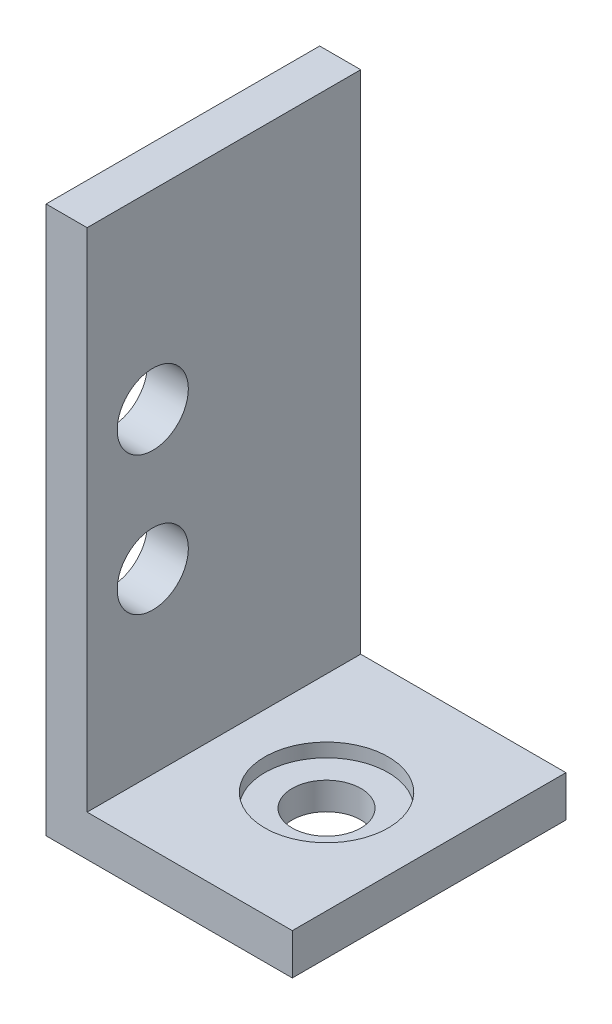
ISO-10303-21;
HEADER;
FILE_DESCRIPTION(('STEP AP214'),'2;1');
FILE_NAME('part.step','',(''),(''),'','','');
FILE_SCHEMA(('AUTOMOTIVE_DESIGN { 1 0 10303 214 1 1 1 1 }'));
ENDSEC;
DATA;
#1=APPLICATION_CONTEXT('core data for automotive mechanical design processes');
#2=APPLICATION_PROTOCOL_DEFINITION('international standard','automotive_design',2000,#1);
#3=PRODUCT_CONTEXT('',#1,'mechanical');
#4=PRODUCT('Part','Part','',(#3));
#5=PRODUCT_RELATED_PRODUCT_CATEGORY('part','',(#4));
#6=PRODUCT_DEFINITION_FORMATION('','',#4);
#7=PRODUCT_DEFINITION_CONTEXT('part definition',#1,'design');
#8=PRODUCT_DEFINITION('design','',#6,#7);
#9=PRODUCT_DEFINITION_SHAPE('','',#8);
#10=(LENGTH_UNIT() NAMED_UNIT(*) SI_UNIT(.MILLI.,.METRE.));
#11=(NAMED_UNIT(*) PLANE_ANGLE_UNIT() SI_UNIT($,.RADIAN.));
#12=(NAMED_UNIT(*) SI_UNIT($,.STERADIAN.) SOLID_ANGLE_UNIT());
#13=UNCERTAINTY_MEASURE_WITH_UNIT(LENGTH_MEASURE(1.E-05),#10,'distance_accuracy_value','');
#14=(GEOMETRIC_REPRESENTATION_CONTEXT(3) GLOBAL_UNCERTAINTY_ASSIGNED_CONTEXT((#13)) GLOBAL_UNIT_ASSIGNED_CONTEXT((#10,
#11,#12)) REPRESENTATION_CONTEXT('',''));
#15=CARTESIAN_POINT('',(0.,0.,0.));
#16=DIRECTION('',(0.,0.,1.));
#17=DIRECTION('',(1.,0.,0.));
#18=AXIS2_PLACEMENT_3D('',#15,#16,#17);
#19=CARTESIAN_POINT('',(30.6258807045637,3.,-9.11509707766213));
#20=DIRECTION('',(0.,0.,-1.));
#21=DIRECTION('',(-1.,0.,0.));
#22=AXIS2_PLACEMENT_3D('',#19,#20,#21);
#23=PLANE('',#22);
#24=DIRECTION('',(0.,1.,0.));
#25=VECTOR('',#24,1.);
#26=CARTESIAN_POINT('',(15.6258807045637,0.,-9.11509707766213));
#27=LINE('',#26,#25);
#28=CARTESIAN_POINT('',(15.6258807045637,3.,-9.11509707766213));
#29=VERTEX_POINT('',#28);
#30=CARTESIAN_POINT('',(15.6258807045636,40.,-9.11509707766213));
#31=VERTEX_POINT('',#30);
#32=EDGE_CURVE('E50',#29,#31,#27,.T.);
#33=ORIENTED_EDGE('',*,*,#32,.T.);
#34=DIRECTION('',(-1.,0.,0.));
#35=VECTOR('',#34,1.);
#36=CARTESIAN_POINT('',(15.6258807045636,40.,-9.11509707766213));
#37=LINE('',#36,#35);
#38=CARTESIAN_POINT('',(12.6258807045636,40.,-9.11509707766213));
#39=VERTEX_POINT('',#38);
#40=EDGE_CURVE('E127',#31,#39,#37,.T.);
#41=ORIENTED_EDGE('',*,*,#40,.T.);
#42=DIRECTION('',(0.,1.,0.));
#43=VECTOR('',#42,1.);
#44=CARTESIAN_POINT('',(12.6258807045636,0.,-9.11509707766213));
#45=LINE('',#44,#43);
#46=CARTESIAN_POINT('',(12.6258807045636,0.,-9.11509707766213));
#47=VERTEX_POINT('',#46);
#48=EDGE_CURVE('E96',#47,#39,#45,.T.);
#49=ORIENTED_EDGE('',*,*,#48,.F.);
#50=DIRECTION('',(1.,0.,0.));
#51=VECTOR('',#50,1.);
#52=CARTESIAN_POINT('',(30.6258807045637,0.,-9.11509707766213));
#53=LINE('',#52,#51);
#54=CARTESIAN_POINT('',(30.6258807045637,0.,-9.11509707766213));
#55=VERTEX_POINT('',#54);
#56=EDGE_CURVE('E93',#47,#55,#53,.T.);
#57=ORIENTED_EDGE('',*,*,#56,.T.);
#58=DIRECTION('',(0.,-1.,0.));
#59=VECTOR('',#58,1.);
#60=CARTESIAN_POINT('',(30.6258807045637,3.,-9.11509707766213));
#61=LINE('',#60,#59);
#62=CARTESIAN_POINT('',(30.6258807045637,3.,-9.11509707766213));
#63=VERTEX_POINT('',#62);
#64=EDGE_CURVE('E11',#63,#55,#61,.T.);
#65=ORIENTED_EDGE('',*,*,#64,.F.);
#66=DIRECTION('',(1.,0.,0.));
#67=VECTOR('',#66,1.);
#68=CARTESIAN_POINT('',(30.6258807045637,3.,-9.11509707766213));
#69=LINE('',#68,#67);
#70=EDGE_CURVE('E85',#29,#63,#69,.T.);
#71=ORIENTED_EDGE('',*,*,#70,.F.);
#72=EDGE_LOOP('',(#33,#41,#49,#57,#65,#71));
#73=FACE_BOUND('',#72,.T.);
#74=ADVANCED_FACE('F33',(#73),#23,.F.);
#75=CARTESIAN_POINT('',(15.6258807045636,3.,-29.1150970776621));
#76=DIRECTION('',(0.,0.,1.));
#77=DIRECTION('',(1.,0.,0.));
#78=AXIS2_PLACEMENT_3D('',#75,#76,#77);
#79=PLANE('',#78);
#80=DIRECTION('',(0.,1.,0.));
#81=VECTOR('',#80,1.);
#82=CARTESIAN_POINT('',(12.6258807045636,0.,-29.1150970776621));
#83=LINE('',#82,#81);
#84=CARTESIAN_POINT('',(12.6258807045636,0.,-29.1150970776621));
#85=VERTEX_POINT('',#84);
#86=CARTESIAN_POINT('',(12.6258807045636,40.,-29.1150970776622));
#87=VERTEX_POINT('',#86);
#88=EDGE_CURVE('E118',#85,#87,#83,.T.);
#89=ORIENTED_EDGE('',*,*,#88,.T.);
#90=DIRECTION('',(-1.,0.,0.));
#91=VECTOR('',#90,1.);
#92=CARTESIAN_POINT('',(15.6258807045636,40.,-29.1150970776622));
#93=LINE('',#92,#91);
#94=CARTESIAN_POINT('',(15.6258807045636,40.,-29.1150970776622));
#95=VERTEX_POINT('',#94);
#96=EDGE_CURVE('E126',#95,#87,#93,.T.);
#97=ORIENTED_EDGE('',*,*,#96,.F.);
#98=DIRECTION('',(0.,1.,0.));
#99=VECTOR('',#98,1.);
#100=CARTESIAN_POINT('',(15.6258807045636,0.,-29.1150970776621));
#101=LINE('',#100,#99);
#102=CARTESIAN_POINT('',(15.6258807045636,3.,-29.1150970776621));
#103=VERTEX_POINT('',#102);
#104=EDGE_CURVE('E115',#103,#95,#101,.T.);
#105=ORIENTED_EDGE('',*,*,#104,.F.);
#106=DIRECTION('',(-1.,0.,0.));
#107=VECTOR('',#106,1.);
#108=CARTESIAN_POINT('',(15.6258807045636,3.,-29.1150970776621));
#109=LINE('',#108,#107);
#110=CARTESIAN_POINT('',(30.6258807045637,3.,-29.1150970776621));
#111=VERTEX_POINT('',#110);
#112=EDGE_CURVE('E84',#111,#103,#109,.T.);
#113=ORIENTED_EDGE('',*,*,#112,.F.);
#114=DIRECTION('',(0.,-1.,0.));
#115=VECTOR('',#114,1.);
#116=CARTESIAN_POINT('',(30.6258807045637,3.,-29.1150970776621));
#117=LINE('',#116,#115);
#118=CARTESIAN_POINT('',(30.6258807045637,0.,-29.1150970776621));
#119=VERTEX_POINT('',#118);
#120=EDGE_CURVE('E42',#111,#119,#117,.T.);
#121=ORIENTED_EDGE('',*,*,#120,.T.);
#122=DIRECTION('',(-1.,0.,0.));
#123=VECTOR('',#122,1.);
#124=CARTESIAN_POINT('',(15.6258807045636,0.,-29.1150970776621));
#125=LINE('',#124,#123);
#126=EDGE_CURVE('E90',#119,#85,#125,.T.);
#127=ORIENTED_EDGE('',*,*,#126,.T.);
#128=EDGE_LOOP('',(#89,#97,#105,#113,#121,#127));
#129=FACE_BOUND('',#128,.T.);
#130=ADVANCED_FACE('F163',(#129),#79,.F.);
#131=CARTESIAN_POINT('',(15.6258807045636,0.,-29.1150970776621));
#132=DIRECTION('',(1.,0.,0.));
#133=DIRECTION('',(0.,0.,-1.));
#134=AXIS2_PLACEMENT_3D('',#131,#132,#133);
#135=PLANE('',#134);
#136=CARTESIAN_POINT('',(15.6258807045636,16.,-13.9150970776621));
#137=DIRECTION('',(1.,0.,0.));
#138=DIRECTION('',(0.,0.,-1.));
#139=AXIS2_PLACEMENT_3D('',#136,#137,#138);
#140=CIRCLE('',#139,2.6);
#141=CARTESIAN_POINT('',(15.6258807045636,16.,-16.5150970776621));
#142=VERTEX_POINT('',#141);
#143=EDGE_CURVE('E144',#142,#142,#140,.T.);
#144=ORIENTED_EDGE('',*,*,#143,.F.);
#145=EDGE_LOOP('',(#144));
#146=FACE_BOUND('',#145,.T.);
#147=CARTESIAN_POINT('',(15.6258807045636,26.1,-13.9150970776621));
#148=DIRECTION('',(1.,0.,0.));
#149=DIRECTION('',(0.,0.,-1.));
#150=AXIS2_PLACEMENT_3D('',#147,#148,#149);
#151=CIRCLE('',#150,2.6);
#152=CARTESIAN_POINT('',(15.6258807045636,26.1,-16.5150970776621));
#153=VERTEX_POINT('',#152);
#154=EDGE_CURVE('E138',#153,#153,#151,.T.);
#155=ORIENTED_EDGE('',*,*,#154,.F.);
#156=EDGE_LOOP('',(#155));
#157=FACE_BOUND('',#156,.T.);
#158=ORIENTED_EDGE('',*,*,#104,.T.);
#159=DIRECTION('',(0.,0.,-1.));
#160=VECTOR('',#159,1.);
#161=CARTESIAN_POINT('',(15.6258807045636,40.,-29.1150970776622));
#162=LINE('',#161,#160);
#163=EDGE_CURVE('E129',#31,#95,#162,.T.);
#164=ORIENTED_EDGE('',*,*,#163,.F.);
#165=ORIENTED_EDGE('',*,*,#32,.F.);
#166=DIRECTION('',(0.,0.,1.));
#167=VECTOR('',#166,1.);
#168=CARTESIAN_POINT('',(15.6258807045637,3.,-9.11509707766213));
#169=LINE('',#168,#167);
#170=EDGE_CURVE('E67',#103,#29,#169,.T.);
#171=ORIENTED_EDGE('',*,*,#170,.F.);
#172=EDGE_LOOP('',(#158,#164,#165,#171));
#173=FACE_BOUND('',#172,.T.);
#174=ADVANCED_FACE('F160',(#146,#157,#173),#135,.T.);
#175=CARTESIAN_POINT('',(12.6258807045636,0.,-29.1150970776621));
#176=DIRECTION('',(-1.,0.,0.));
#177=DIRECTION('',(0.,0.,1.));
#178=AXIS2_PLACEMENT_3D('',#175,#176,#177);
#179=PLANE('',#178);
#180=CARTESIAN_POINT('',(12.6258807045636,16.,-13.9150970776621));
#181=DIRECTION('',(1.,0.,0.));
#182=DIRECTION('',(0.,0.,-1.));
#183=AXIS2_PLACEMENT_3D('',#180,#181,#182);
#184=CIRCLE('',#183,2.6);
#185=CARTESIAN_POINT('',(12.6258807045636,16.,-16.5150970776621));
#186=VERTEX_POINT('',#185);
#187=EDGE_CURVE('E135',#186,#186,#184,.T.);
#188=ORIENTED_EDGE('',*,*,#187,.T.);
#189=EDGE_LOOP('',(#188));
#190=FACE_BOUND('',#189,.T.);
#191=CARTESIAN_POINT('',(12.6258807045636,26.1,-13.9150970776621));
#192=DIRECTION('',(1.,0.,0.));
#193=DIRECTION('',(0.,0.,-1.));
#194=AXIS2_PLACEMENT_3D('',#191,#192,#193);
#195=CIRCLE('',#194,2.6);
#196=CARTESIAN_POINT('',(12.6258807045636,26.1,-16.5150970776621));
#197=VERTEX_POINT('',#196);
#198=EDGE_CURVE('E141',#197,#197,#195,.T.);
#199=ORIENTED_EDGE('',*,*,#198,.T.);
#200=EDGE_LOOP('',(#199));
#201=FACE_BOUND('',#200,.T.);
#202=ORIENTED_EDGE('',*,*,#48,.T.);
#203=DIRECTION('',(0.,0.,-1.));
#204=VECTOR('',#203,1.);
#205=CARTESIAN_POINT('',(12.6258807045636,40.,-29.1150970776622));
#206=LINE('',#205,#204);
#207=EDGE_CURVE('E132',#39,#87,#206,.T.);
#208=ORIENTED_EDGE('',*,*,#207,.T.);
#209=ORIENTED_EDGE('',*,*,#88,.F.);
#210=DIRECTION('',(0.,0.,1.));
#211=VECTOR('',#210,1.);
#212=CARTESIAN_POINT('',(12.6258807045636,0.,-29.1150970776621));
#213=LINE('',#212,#211);
#214=EDGE_CURVE('E121',#85,#47,#213,.T.);
#215=ORIENTED_EDGE('',*,*,#214,.T.);
#216=EDGE_LOOP('',(#202,#208,#209,#215));
#217=FACE_BOUND('',#216,.T.);
#218=ADVANCED_FACE('F150',(#190,#201,#217),#179,.T.);
#219=CARTESIAN_POINT('',(23.1258807045636,3.,-19.1150970776621));
#220=DIRECTION('',(0.,-1.,0.));
#221=DIRECTION('',(0.,0.,-1.));
#222=AXIS2_PLACEMENT_3D('',#219,#220,#221);
#223=CYLINDRICAL_SURFACE('',#222,2.51);
#224=CARTESIAN_POINT('',(23.1258807045636,0.,-19.1150970776621));
#225=DIRECTION('',(0.,1.,0.));
#226=DIRECTION('',(0.,0.,1.));
#227=AXIS2_PLACEMENT_3D('',#224,#225,#226);
#228=CIRCLE('',#227,2.51);
#229=CARTESIAN_POINT('',(23.1258807045636,0.,-16.6050970776621));
#230=VERTEX_POINT('',#229);
#231=EDGE_CURVE('E99',#230,#230,#228,.T.);
#232=ORIENTED_EDGE('',*,*,#231,.F.);
#233=EDGE_LOOP('',(#232));
#234=FACE_BOUND('',#233,.T.);
#235=CARTESIAN_POINT('',(23.1258807045636,2.,-19.1150970776621));
#236=DIRECTION('',(0.,1.,0.));
#237=DIRECTION('',(0.,0.,1.));
#238=AXIS2_PLACEMENT_3D('',#235,#236,#237);
#239=CIRCLE('',#238,2.51);
#240=CARTESIAN_POINT('',(23.1258807045636,2.,-16.6050970776621));
#241=VERTEX_POINT('',#240);
#242=EDGE_CURVE('E36',#241,#241,#239,.T.);
#243=ORIENTED_EDGE('',*,*,#242,.T.);
#244=EDGE_LOOP('',(#243));
#245=FACE_BOUND('',#244,.T.);
#246=ADVANCED_FACE('F187',(#234,#245),#223,.F.);
#247=CARTESIAN_POINT('',(0.,3.,0.));
#248=DIRECTION('',(0.,-1.,0.));
#249=DIRECTION('',(0.,0.,-1.));
#250=AXIS2_PLACEMENT_3D('',#247,#248,#249);
#251=PLANE('',#250);
#252=CARTESIAN_POINT('',(23.1258807045636,3.,-19.1150970776621));
#253=DIRECTION('',(0.,1.,0.));
#254=DIRECTION('',(0.,0.,1.));
#255=AXIS2_PLACEMENT_3D('',#252,#253,#254);
#256=CIRCLE('',#255,4.51);
#257=CARTESIAN_POINT('',(23.1258807045636,3.,-14.6050970776621));
#258=VERTEX_POINT('',#257);
#259=EDGE_CURVE('E111',#258,#258,#256,.T.);
#260=ORIENTED_EDGE('',*,*,#259,.F.);
#261=EDGE_LOOP('',(#260));
#262=FACE_BOUND('',#261,.T.);
#263=ORIENTED_EDGE('',*,*,#70,.T.);
#264=DIRECTION('',(0.,0.,-1.));
#265=VECTOR('',#264,1.);
#266=CARTESIAN_POINT('',(30.6258807045637,3.,-9.11509707766213));
#267=LINE('',#266,#265);
#268=EDGE_CURVE('E75',#63,#111,#267,.T.);
#269=ORIENTED_EDGE('',*,*,#268,.T.);
#270=ORIENTED_EDGE('',*,*,#112,.T.);
#271=ORIENTED_EDGE('',*,*,#170,.T.);
#272=EDGE_LOOP('',(#263,#269,#270,#271));
#273=FACE_BOUND('',#272,.T.);
#274=ADVANCED_FACE('F88',(#262,#273),#251,.F.);
#275=CARTESIAN_POINT('',(0.,0.,0.));
#276=DIRECTION('',(0.,-1.,0.));
#277=DIRECTION('',(0.,0.,-1.));
#278=AXIS2_PLACEMENT_3D('',#275,#276,#277);
#279=PLANE('',#278);
#280=ORIENTED_EDGE('',*,*,#56,.F.);
#281=ORIENTED_EDGE('',*,*,#214,.F.);
#282=ORIENTED_EDGE('',*,*,#126,.F.);
#283=DIRECTION('',(0.,0.,-1.));
#284=VECTOR('',#283,1.);
#285=CARTESIAN_POINT('',(30.6258807045637,0.,-9.11509707766213));
#286=LINE('',#285,#284);
#287=EDGE_CURVE('E63',#55,#119,#286,.T.);
#288=ORIENTED_EDGE('',*,*,#287,.F.);
#289=EDGE_LOOP('',(#280,#281,#282,#288));
#290=FACE_BOUND('',#289,.T.);
#291=ORIENTED_EDGE('',*,*,#231,.T.);
#292=EDGE_LOOP('',(#291));
#293=FACE_BOUND('',#292,.T.);
#294=ADVANCED_FACE('F181',(#290,#293),#279,.T.);
#295=CARTESIAN_POINT('',(30.6258807045637,3.,-9.11509707766213));
#296=DIRECTION('',(-1.,0.,0.));
#297=DIRECTION('',(0.,0.,1.));
#298=AXIS2_PLACEMENT_3D('',#295,#296,#297);
#299=PLANE('',#298);
#300=ORIENTED_EDGE('',*,*,#287,.T.);
#301=ORIENTED_EDGE('',*,*,#120,.F.);
#302=ORIENTED_EDGE('',*,*,#268,.F.);
#303=ORIENTED_EDGE('',*,*,#64,.T.);
#304=EDGE_LOOP('',(#300,#301,#302,#303));
#305=FACE_BOUND('',#304,.T.);
#306=ADVANCED_FACE('F77',(#305),#299,.F.);
#307=CARTESIAN_POINT('',(23.1258807045636,2.,-19.1150970776621));
#308=DIRECTION('',(0.,1.,0.));
#309=DIRECTION('',(0.,0.,1.));
#310=AXIS2_PLACEMENT_3D('',#307,#308,#309);
#311=CYLINDRICAL_SURFACE('',#310,4.51);
#312=CARTESIAN_POINT('',(23.1258807045636,2.,-19.1150970776621));
#313=DIRECTION('',(0.,1.,0.));
#314=DIRECTION('',(0.,0.,1.));
#315=AXIS2_PLACEMENT_3D('',#312,#313,#314);
#316=CIRCLE('',#315,4.51);
#317=CARTESIAN_POINT('',(23.1258807045636,2.,-14.6050970776621));
#318=VERTEX_POINT('',#317);
#319=EDGE_CURVE('E114',#318,#318,#316,.T.);
#320=ORIENTED_EDGE('',*,*,#319,.F.);
#321=EDGE_LOOP('',(#320));
#322=FACE_BOUND('',#321,.T.);
#323=ORIENTED_EDGE('',*,*,#259,.T.);
#324=EDGE_LOOP('',(#323));
#325=FACE_BOUND('',#324,.T.);
#326=ADVANCED_FACE('F197',(#322,#325),#311,.F.);
#327=CARTESIAN_POINT('',(23.1258807045636,2.,-19.1150970776621));
#328=DIRECTION('',(0.,1.,0.));
#329=DIRECTION('',(0.,0.,1.));
#330=AXIS2_PLACEMENT_3D('',#327,#328,#329);
#331=PLANE('',#330);
#332=ORIENTED_EDGE('',*,*,#242,.F.);
#333=EDGE_LOOP('',(#332));
#334=FACE_BOUND('',#333,.T.);
#335=ORIENTED_EDGE('',*,*,#319,.T.);
#336=EDGE_LOOP('',(#335));
#337=FACE_BOUND('',#336,.T.);
#338=ADVANCED_FACE('F194',(#334,#337),#331,.T.);
#339=CARTESIAN_POINT('',(15.6258807045636,40.,-29.1150970776622));
#340=DIRECTION('',(0.,1.,0.));
#341=DIRECTION('',(0.,0.,1.));
#342=AXIS2_PLACEMENT_3D('',#339,#340,#341);
#343=PLANE('',#342);
#344=ORIENTED_EDGE('',*,*,#207,.F.);
#345=ORIENTED_EDGE('',*,*,#40,.F.);
#346=ORIENTED_EDGE('',*,*,#163,.T.);
#347=ORIENTED_EDGE('',*,*,#96,.T.);
#348=EDGE_LOOP('',(#344,#345,#346,#347));
#349=FACE_BOUND('',#348,.T.);
#350=ADVANCED_FACE('F175',(#349),#343,.T.);
#351=CARTESIAN_POINT('',(12.6258807045636,26.1,-13.9150970776621));
#352=DIRECTION('',(1.,0.,0.));
#353=DIRECTION('',(0.,0.,-1.));
#354=AXIS2_PLACEMENT_3D('',#351,#352,#353);
#355=CYLINDRICAL_SURFACE('',#354,2.6);
#356=ORIENTED_EDGE('',*,*,#198,.F.);
#357=EDGE_LOOP('',(#356));
#358=FACE_BOUND('',#357,.T.);
#359=ORIENTED_EDGE('',*,*,#154,.T.);
#360=EDGE_LOOP('',(#359));
#361=FACE_BOUND('',#360,.T.);
#362=ADVANCED_FACE('F156',(#358,#361),#355,.F.);
#363=CARTESIAN_POINT('',(12.6258807045636,16.,-13.9150970776621));
#364=DIRECTION('',(1.,0.,0.));
#365=DIRECTION('',(0.,0.,-1.));
#366=AXIS2_PLACEMENT_3D('',#363,#364,#365);
#367=CYLINDRICAL_SURFACE('',#366,2.6);
#368=ORIENTED_EDGE('',*,*,#187,.F.);
#369=EDGE_LOOP('',(#368));
#370=FACE_BOUND('',#369,.T.);
#371=ORIENTED_EDGE('',*,*,#143,.T.);
#372=EDGE_LOOP('',(#371));
#373=FACE_BOUND('',#372,.T.);
#374=ADVANCED_FACE('F153',(#370,#373),#367,.F.);
#375=CLOSED_SHELL('',(#74,#130,#174,#218,#246,#274,#294,#306,#326,#338,#350,#362,#374));
#376=MANIFOLD_SOLID_BREP('B2',#375);
#377=ADVANCED_BREP_SHAPE_REPRESENTATION('',(#18,#376),#14);
#378=SHAPE_DEFINITION_REPRESENTATION(#9,#377);
ENDSEC;
END-ISO-10303-21;
